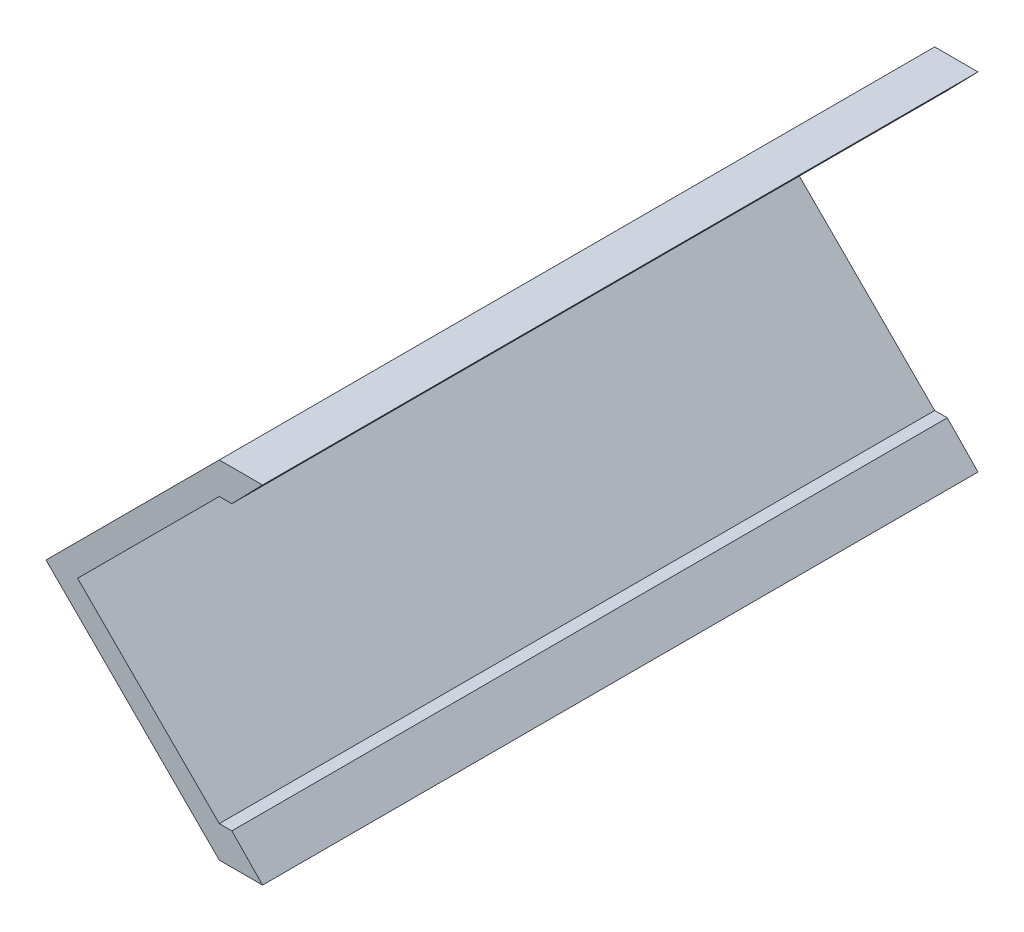
ISO-10303-21;
HEADER;
FILE_DESCRIPTION(('STEP AP214'),'2;1');
FILE_NAME('part.step','',(''),(''),'','','');
FILE_SCHEMA(('AUTOMOTIVE_DESIGN { 1 0 10303 214 1 1 1 1 }'));
ENDSEC;
DATA;
#1=APPLICATION_CONTEXT('core data for automotive mechanical design processes');
#2=APPLICATION_PROTOCOL_DEFINITION('international standard','automotive_design',2000,#1);
#3=PRODUCT_CONTEXT('',#1,'mechanical');
#4=PRODUCT('Part','Part','',(#3));
#5=PRODUCT_RELATED_PRODUCT_CATEGORY('part','',(#4));
#6=PRODUCT_DEFINITION_FORMATION('','',#4);
#7=PRODUCT_DEFINITION_CONTEXT('part definition',#1,'design');
#8=PRODUCT_DEFINITION('design','',#6,#7);
#9=PRODUCT_DEFINITION_SHAPE('','',#8);
#10=(LENGTH_UNIT() NAMED_UNIT(*) SI_UNIT(.MILLI.,.METRE.));
#11=(NAMED_UNIT(*) PLANE_ANGLE_UNIT() SI_UNIT($,.RADIAN.));
#12=(NAMED_UNIT(*) SI_UNIT($,.STERADIAN.) SOLID_ANGLE_UNIT());
#13=UNCERTAINTY_MEASURE_WITH_UNIT(LENGTH_MEASURE(1.E-05),#10,'distance_accuracy_value','');
#14=(GEOMETRIC_REPRESENTATION_CONTEXT(3) GLOBAL_UNCERTAINTY_ASSIGNED_CONTEXT((#13)) GLOBAL_UNIT_ASSIGNED_CONTEXT((#10,
#11,#12)) REPRESENTATION_CONTEXT('',''));
#15=CARTESIAN_POINT('',(0.,0.,0.));
#16=DIRECTION('',(0.,0.,1.));
#17=DIRECTION('',(1.,0.,0.));
#18=AXIS2_PLACEMENT_3D('',#15,#16,#17);
#19=CARTESIAN_POINT('',(34.4,12.4,51.2));
#20=DIRECTION('',(0.707106781186548,-0.707106781186548,0.));
#21=DIRECTION('',(0.707106781186548,0.707106781186548,0.));
#22=AXIS2_PLACEMENT_3D('',#19,#20,#21);
#23=PLANE('',#22);
#24=DIRECTION('',(-0.707106781186547,-0.707106781186547,0.));
#25=VECTOR('',#24,1.);
#26=CARTESIAN_POINT('',(34.4,12.4,0.));
#27=LINE('',#26,#25);
#28=CARTESIAN_POINT('',(34.4,12.4,0.));
#29=VERTEX_POINT('',#28);
#30=CARTESIAN_POINT('',(22.,0.,0.));
#31=VERTEX_POINT('',#30);
#32=EDGE_CURVE('E151',#29,#31,#27,.T.);
#33=ORIENTED_EDGE('',*,*,#32,.T.);
#34=DIRECTION('',(0.,0.,-1.));
#35=VECTOR('',#34,1.);
#36=CARTESIAN_POINT('',(22.,0.,51.2));
#37=LINE('',#36,#35);
#38=CARTESIAN_POINT('',(22.,0.,51.2));
#39=VERTEX_POINT('',#38);
#40=EDGE_CURVE('E11',#39,#31,#37,.T.);
#41=ORIENTED_EDGE('',*,*,#40,.F.);
#42=DIRECTION('',(-0.707106781186547,-0.707106781186547,0.));
#43=VECTOR('',#42,1.);
#44=CARTESIAN_POINT('',(34.4,12.4,51.2));
#45=LINE('',#44,#43);
#46=CARTESIAN_POINT('',(34.4,12.4,51.2));
#47=VERTEX_POINT('',#46);
#48=EDGE_CURVE('E170',#47,#39,#45,.T.);
#49=ORIENTED_EDGE('',*,*,#48,.F.);
#50=DIRECTION('',(0.,0.,-1.));
#51=VECTOR('',#50,1.);
#52=CARTESIAN_POINT('',(34.4,12.4,51.2));
#53=LINE('',#52,#51);
#54=EDGE_CURVE('E150',#47,#29,#53,.T.);
#55=ORIENTED_EDGE('',*,*,#54,.T.);
#56=EDGE_LOOP('',(#33,#41,#49,#55));
#57=FACE_BOUND('',#56,.T.);
#58=ADVANCED_FACE('F43',(#57),#23,.F.);
#59=CARTESIAN_POINT('',(22.,0.,51.2));
#60=DIRECTION('',(0.707106781186548,0.707106781186548,0.));
#61=DIRECTION('',(-0.707106781186548,0.707106781186548,0.));
#62=AXIS2_PLACEMENT_3D('',#59,#60,#61);
#63=PLANE('',#62);
#64=DIRECTION('',(0.707106781186547,-0.707106781186547,0.));
#65=VECTOR('',#64,1.);
#66=CARTESIAN_POINT('',(22.,0.,0.));
#67=LINE('',#66,#65);
#68=CARTESIAN_POINT('',(34.4,-12.4,0.));
#69=VERTEX_POINT('',#68);
#70=EDGE_CURVE('E153',#31,#69,#67,.T.);
#71=ORIENTED_EDGE('',*,*,#70,.T.);
#72=DIRECTION('',(0.,0.,-1.));
#73=VECTOR('',#72,1.);
#74=CARTESIAN_POINT('',(34.4,-12.4,51.2));
#75=LINE('',#74,#73);
#76=CARTESIAN_POINT('',(34.4,-12.4,51.2));
#77=VERTEX_POINT('',#76);
#78=EDGE_CURVE('E51',#77,#69,#75,.T.);
#79=ORIENTED_EDGE('',*,*,#78,.F.);
#80=DIRECTION('',(0.707106781186547,-0.707106781186547,0.));
#81=VECTOR('',#80,1.);
#82=CARTESIAN_POINT('',(22.,0.,51.2));
#83=LINE('',#82,#81);
#84=EDGE_CURVE('E109',#39,#77,#83,.T.);
#85=ORIENTED_EDGE('',*,*,#84,.F.);
#86=ORIENTED_EDGE('',*,*,#40,.T.);
#87=EDGE_LOOP('',(#71,#79,#85,#86));
#88=FACE_BOUND('',#87,.T.);
#89=ADVANCED_FACE('F216',(#88),#63,.F.);
#90=CARTESIAN_POINT('',(34.4,-12.4,51.2));
#91=DIRECTION('',(0.,1.,0.));
#92=DIRECTION('',(0.,0.,1.));
#93=AXIS2_PLACEMENT_3D('',#90,#91,#92);
#94=PLANE('',#93);
#95=DIRECTION('',(1.,0.,0.));
#96=VECTOR('',#95,1.);
#97=CARTESIAN_POINT('',(34.4,-12.4,0.));
#98=LINE('',#97,#96);
#99=CARTESIAN_POINT('',(37.4975002975482,-12.4,0.));
#100=VERTEX_POINT('',#99);
#101=EDGE_CURVE('E157',#69,#100,#98,.T.);
#102=ORIENTED_EDGE('',*,*,#101,.T.);
#103=DIRECTION('',(0.,0.,-1.));
#104=VECTOR('',#103,1.);
#105=CARTESIAN_POINT('',(37.4975002975482,-12.4,51.2));
#106=LINE('',#105,#104);
#107=CARTESIAN_POINT('',(37.4975002975482,-12.4,51.2));
#108=VERTEX_POINT('',#107);
#109=EDGE_CURVE('E185',#108,#100,#106,.T.);
#110=ORIENTED_EDGE('',*,*,#109,.F.);
#111=DIRECTION('',(1.,0.,0.));
#112=VECTOR('',#111,1.);
#113=CARTESIAN_POINT('',(34.4,-12.4,51.2));
#114=LINE('',#113,#112);
#115=EDGE_CURVE('E189',#77,#108,#114,.T.);
#116=ORIENTED_EDGE('',*,*,#115,.F.);
#117=ORIENTED_EDGE('',*,*,#78,.T.);
#118=EDGE_LOOP('',(#102,#110,#116,#117));
#119=FACE_BOUND('',#118,.T.);
#120=ADVANCED_FACE('F187',(#119),#94,.F.);
#121=CARTESIAN_POINT('',(37.4975002975482,-12.4,51.2));
#122=DIRECTION('',(-0.717320134948834,-0.696743729069007,0.));
#123=DIRECTION('',(0.696743729069008,-0.717320134948834,0.));
#124=AXIS2_PLACEMENT_3D('',#121,#122,#123);
#125=PLANE('',#124);
#126=DIRECTION('',(-0.696743729069007,0.717320134948834,0.));
#127=VECTOR('',#126,1.);
#128=CARTESIAN_POINT('',(37.4975002975482,-12.4,0.));
#129=LINE('',#128,#127);
#130=CARTESIAN_POINT('',(35.299665588853,-10.137258300203,0.));
#131=VERTEX_POINT('',#130);
#132=EDGE_CURVE('E156',#100,#131,#129,.T.);
#133=ORIENTED_EDGE('',*,*,#132,.T.);
#134=DIRECTION('',(0.,0.,-1.));
#135=VECTOR('',#134,1.);
#136=CARTESIAN_POINT('',(35.299665588853,-10.137258300203,51.2));
#137=LINE('',#136,#135);
#138=CARTESIAN_POINT('',(35.299665588853,-10.137258300203,51.2));
#139=VERTEX_POINT('',#138);
#140=EDGE_CURVE('E177',#139,#131,#137,.T.);
#141=ORIENTED_EDGE('',*,*,#140,.F.);
#142=DIRECTION('',(-0.696743729069007,0.717320134948834,0.));
#143=VECTOR('',#142,1.);
#144=CARTESIAN_POINT('',(37.4975002975482,-12.4,51.2));
#145=LINE('',#144,#143);
#146=EDGE_CURVE('E209',#108,#139,#145,.T.);
#147=ORIENTED_EDGE('',*,*,#146,.F.);
#148=ORIENTED_EDGE('',*,*,#109,.T.);
#149=EDGE_LOOP('',(#133,#141,#147,#148));
#150=FACE_BOUND('',#149,.T.);
#151=ADVANCED_FACE('F198',(#150),#125,.F.);
#152=CARTESIAN_POINT('',(35.299665588853,-10.137258300203,51.2));
#153=DIRECTION('',(0.,-1.,0.));
#154=DIRECTION('',(0.,0.,-1.));
#155=AXIS2_PLACEMENT_3D('',#152,#153,#154);
#156=PLANE('',#155);
#157=DIRECTION('',(-1.,0.,0.));
#158=VECTOR('',#157,1.);
#159=CARTESIAN_POINT('',(35.299665588853,-10.137258300203,0.));
#160=LINE('',#159,#158);
#161=CARTESIAN_POINT('',(34.4,-10.137258300203,0.));
#162=VERTEX_POINT('',#161);
#163=EDGE_CURVE('E158',#131,#162,#160,.T.);
#164=ORIENTED_EDGE('',*,*,#163,.T.);
#165=DIRECTION('',(0.,0.,-1.));
#166=VECTOR('',#165,1.);
#167=CARTESIAN_POINT('',(34.4,-10.137258300203,51.2));
#168=LINE('',#167,#166);
#169=CARTESIAN_POINT('',(34.4,-10.137258300203,51.2));
#170=VERTEX_POINT('',#169);
#171=EDGE_CURVE('E176',#170,#162,#168,.T.);
#172=ORIENTED_EDGE('',*,*,#171,.F.);
#173=DIRECTION('',(-1.,0.,0.));
#174=VECTOR('',#173,1.);
#175=CARTESIAN_POINT('',(35.299665588853,-10.137258300203,51.2));
#176=LINE('',#175,#174);
#177=EDGE_CURVE('E203',#139,#170,#176,.T.);
#178=ORIENTED_EDGE('',*,*,#177,.F.);
#179=ORIENTED_EDGE('',*,*,#140,.T.);
#180=EDGE_LOOP('',(#164,#172,#178,#179));
#181=FACE_BOUND('',#180,.T.);
#182=ADVANCED_FACE('F201',(#181),#156,.F.);
#183=CARTESIAN_POINT('',(34.4,-10.137258300203,51.2));
#184=DIRECTION('',(-0.707106781186547,-0.707106781186548,0.));
#185=DIRECTION('',(0.707106781186548,-0.707106781186547,0.));
#186=AXIS2_PLACEMENT_3D('',#183,#184,#185);
#187=PLANE('',#186);
#188=DIRECTION('',(-0.707106781186547,0.707106781186547,0.));
#189=VECTOR('',#188,1.);
#190=CARTESIAN_POINT('',(34.4,-10.137258300203,0.));
#191=LINE('',#190,#189);
#192=CARTESIAN_POINT('',(24.262741699797,0.,0.));
#193=VERTEX_POINT('',#192);
#194=EDGE_CURVE('E162',#162,#193,#191,.T.);
#195=ORIENTED_EDGE('',*,*,#194,.T.);
#196=DIRECTION('',(0.,0.,-1.));
#197=VECTOR('',#196,1.);
#198=CARTESIAN_POINT('',(24.262741699797,0.,51.2));
#199=LINE('',#198,#197);
#200=CARTESIAN_POINT('',(24.262741699797,0.,51.2));
#201=VERTEX_POINT('',#200);
#202=EDGE_CURVE('E171',#201,#193,#199,.T.);
#203=ORIENTED_EDGE('',*,*,#202,.F.);
#204=DIRECTION('',(-0.707106781186547,0.707106781186547,0.));
#205=VECTOR('',#204,1.);
#206=CARTESIAN_POINT('',(34.4,-10.137258300203,51.2));
#207=LINE('',#206,#205);
#208=EDGE_CURVE('E207',#170,#201,#207,.T.);
#209=ORIENTED_EDGE('',*,*,#208,.F.);
#210=ORIENTED_EDGE('',*,*,#171,.T.);
#211=EDGE_LOOP('',(#195,#203,#209,#210));
#212=FACE_BOUND('',#211,.T.);
#213=ADVANCED_FACE('F229',(#212),#187,.F.);
#214=CARTESIAN_POINT('',(24.262741699797,0.,51.2));
#215=DIRECTION('',(-0.707106781186547,0.707106781186548,0.));
#216=DIRECTION('',(-0.707106781186548,-0.707106781186547,0.));
#217=AXIS2_PLACEMENT_3D('',#214,#215,#216);
#218=PLANE('',#217);
#219=DIRECTION('',(0.707106781186547,0.707106781186547,0.));
#220=VECTOR('',#219,1.);
#221=CARTESIAN_POINT('',(24.262741699797,0.,0.));
#222=LINE('',#221,#220);
#223=CARTESIAN_POINT('',(34.4,10.137258300203,0.));
#224=VERTEX_POINT('',#223);
#225=EDGE_CURVE('E163',#193,#224,#222,.T.);
#226=ORIENTED_EDGE('',*,*,#225,.T.);
#227=DIRECTION('',(0.,0.,-1.));
#228=VECTOR('',#227,1.);
#229=CARTESIAN_POINT('',(34.4,10.137258300203,51.2));
#230=LINE('',#229,#228);
#231=CARTESIAN_POINT('',(34.4,10.137258300203,51.2));
#232=VERTEX_POINT('',#231);
#233=EDGE_CURVE('E145',#232,#224,#230,.T.);
#234=ORIENTED_EDGE('',*,*,#233,.F.);
#235=DIRECTION('',(0.707106781186547,0.707106781186547,0.));
#236=VECTOR('',#235,1.);
#237=CARTESIAN_POINT('',(24.262741699797,0.,51.2));
#238=LINE('',#237,#236);
#239=EDGE_CURVE('E133',#201,#232,#238,.T.);
#240=ORIENTED_EDGE('',*,*,#239,.F.);
#241=ORIENTED_EDGE('',*,*,#202,.T.);
#242=EDGE_LOOP('',(#226,#234,#240,#241));
#243=FACE_BOUND('',#242,.T.);
#244=ADVANCED_FACE('F232',(#243),#218,.F.);
#245=CARTESIAN_POINT('',(34.4,10.137258300203,51.2));
#246=DIRECTION('',(0.,1.,0.));
#247=DIRECTION('',(0.,0.,1.));
#248=AXIS2_PLACEMENT_3D('',#245,#246,#247);
#249=PLANE('',#248);
#250=DIRECTION('',(1.,0.,0.));
#251=VECTOR('',#250,1.);
#252=CARTESIAN_POINT('',(34.4,10.137258300203,0.));
#253=LINE('',#252,#251);
#254=CARTESIAN_POINT('',(35.299665588853,10.137258300203,0.));
#255=VERTEX_POINT('',#254);
#256=EDGE_CURVE('E141',#224,#255,#253,.T.);
#257=ORIENTED_EDGE('',*,*,#256,.T.);
#258=DIRECTION('',(0.,0.,-1.));
#259=VECTOR('',#258,1.);
#260=CARTESIAN_POINT('',(35.299665588853,10.137258300203,51.2));
#261=LINE('',#260,#259);
#262=CARTESIAN_POINT('',(35.299665588853,10.137258300203,51.2));
#263=VERTEX_POINT('',#262);
#264=EDGE_CURVE('E138',#263,#255,#261,.T.);
#265=ORIENTED_EDGE('',*,*,#264,.F.);
#266=DIRECTION('',(1.,0.,0.));
#267=VECTOR('',#266,1.);
#268=CARTESIAN_POINT('',(34.4,10.137258300203,51.2));
#269=LINE('',#268,#267);
#270=EDGE_CURVE('E130',#232,#263,#269,.T.);
#271=ORIENTED_EDGE('',*,*,#270,.F.);
#272=ORIENTED_EDGE('',*,*,#233,.T.);
#273=EDGE_LOOP('',(#257,#265,#271,#272));
#274=FACE_BOUND('',#273,.T.);
#275=ADVANCED_FACE('F137',(#274),#249,.F.);
#276=CARTESIAN_POINT('',(35.299665588853,10.137258300203,51.2));
#277=DIRECTION('',(-0.717320134948834,0.696743729069007,0.));
#278=DIRECTION('',(-0.696743729069008,-0.717320134948834,0.));
#279=AXIS2_PLACEMENT_3D('',#276,#277,#278);
#280=PLANE('',#279);
#281=DIRECTION('',(0.696743729069007,0.717320134948834,0.));
#282=VECTOR('',#281,1.);
#283=CARTESIAN_POINT('',(35.299665588853,10.137258300203,0.));
#284=LINE('',#283,#282);
#285=CARTESIAN_POINT('',(37.4975002975482,12.4,0.));
#286=VERTEX_POINT('',#285);
#287=EDGE_CURVE('E92',#255,#286,#284,.T.);
#288=ORIENTED_EDGE('',*,*,#287,.T.);
#289=DIRECTION('',(0.,0.,-1.));
#290=VECTOR('',#289,1.);
#291=CARTESIAN_POINT('',(37.4975002975482,12.4,51.2));
#292=LINE('',#291,#290);
#293=CARTESIAN_POINT('',(37.4975002975482,12.4,51.2));
#294=VERTEX_POINT('',#293);
#295=EDGE_CURVE('E142',#294,#286,#292,.T.);
#296=ORIENTED_EDGE('',*,*,#295,.F.);
#297=DIRECTION('',(0.696743729069007,0.717320134948834,0.));
#298=VECTOR('',#297,1.);
#299=CARTESIAN_POINT('',(35.299665588853,10.137258300203,51.2));
#300=LINE('',#299,#298);
#301=EDGE_CURVE('E131',#263,#294,#300,.T.);
#302=ORIENTED_EDGE('',*,*,#301,.F.);
#303=ORIENTED_EDGE('',*,*,#264,.T.);
#304=EDGE_LOOP('',(#288,#296,#302,#303));
#305=FACE_BOUND('',#304,.T.);
#306=ADVANCED_FACE('F144',(#305),#280,.F.);
#307=CARTESIAN_POINT('',(37.4975002975482,12.4,51.2));
#308=DIRECTION('',(0.,-1.,0.));
#309=DIRECTION('',(0.,0.,-1.));
#310=AXIS2_PLACEMENT_3D('',#307,#308,#309);
#311=PLANE('',#310);
#312=DIRECTION('',(-1.,0.,0.));
#313=VECTOR('',#312,1.);
#314=CARTESIAN_POINT('',(37.4975002975482,12.4,0.));
#315=LINE('',#314,#313);
#316=EDGE_CURVE('E99',#286,#29,#315,.T.);
#317=ORIENTED_EDGE('',*,*,#316,.T.);
#318=ORIENTED_EDGE('',*,*,#54,.F.);
#319=DIRECTION('',(-1.,0.,0.));
#320=VECTOR('',#319,1.);
#321=CARTESIAN_POINT('',(37.4975002975482,12.4,51.2));
#322=LINE('',#321,#320);
#323=EDGE_CURVE('E56',#294,#47,#322,.T.);
#324=ORIENTED_EDGE('',*,*,#323,.F.);
#325=ORIENTED_EDGE('',*,*,#295,.T.);
#326=EDGE_LOOP('',(#317,#318,#324,#325));
#327=FACE_BOUND('',#326,.T.);
#328=ADVANCED_FACE('F242',(#327),#311,.F.);
#329=CARTESIAN_POINT('',(0.,0.,51.2));
#330=DIRECTION('',(0.,0.,1.));
#331=DIRECTION('',(1.,0.,0.));
#332=AXIS2_PLACEMENT_3D('',#329,#330,#331);
#333=PLANE('',#332);
#334=ORIENTED_EDGE('',*,*,#48,.T.);
#335=ORIENTED_EDGE('',*,*,#84,.T.);
#336=ORIENTED_EDGE('',*,*,#115,.T.);
#337=ORIENTED_EDGE('',*,*,#146,.T.);
#338=ORIENTED_EDGE('',*,*,#177,.T.);
#339=ORIENTED_EDGE('',*,*,#208,.T.);
#340=ORIENTED_EDGE('',*,*,#239,.T.);
#341=ORIENTED_EDGE('',*,*,#270,.T.);
#342=ORIENTED_EDGE('',*,*,#301,.T.);
#343=ORIENTED_EDGE('',*,*,#323,.T.);
#344=EDGE_LOOP('',(#334,#335,#336,#337,#338,#339,#340,#341,#342,#343));
#345=FACE_BOUND('',#344,.T.);
#346=ADVANCED_FACE('F129',(#345),#333,.T.);
#347=CARTESIAN_POINT('',(0.,0.,0.));
#348=DIRECTION('',(0.,0.,1.));
#349=DIRECTION('',(1.,0.,0.));
#350=AXIS2_PLACEMENT_3D('',#347,#348,#349);
#351=PLANE('',#350);
#352=ORIENTED_EDGE('',*,*,#32,.F.);
#353=ORIENTED_EDGE('',*,*,#316,.F.);
#354=ORIENTED_EDGE('',*,*,#287,.F.);
#355=ORIENTED_EDGE('',*,*,#256,.F.);
#356=ORIENTED_EDGE('',*,*,#225,.F.);
#357=ORIENTED_EDGE('',*,*,#194,.F.);
#358=ORIENTED_EDGE('',*,*,#163,.F.);
#359=ORIENTED_EDGE('',*,*,#132,.F.);
#360=ORIENTED_EDGE('',*,*,#101,.F.);
#361=ORIENTED_EDGE('',*,*,#70,.F.);
#362=EDGE_LOOP('',(#352,#353,#354,#355,#356,#357,#358,#359,#360,#361));
#363=FACE_BOUND('',#362,.T.);
#364=ADVANCED_FACE('F191',(#363),#351,.F.);
#365=CLOSED_SHELL('',(#58,#89,#120,#151,#182,#213,#244,#275,#306,#328,#346,#364));
#366=MANIFOLD_SOLID_BREP('B2',#365);
#367=ADVANCED_BREP_SHAPE_REPRESENTATION('',(#18,#366),#14);
#368=SHAPE_DEFINITION_REPRESENTATION(#9,#367);
ENDSEC;
END-ISO-10303-21;
